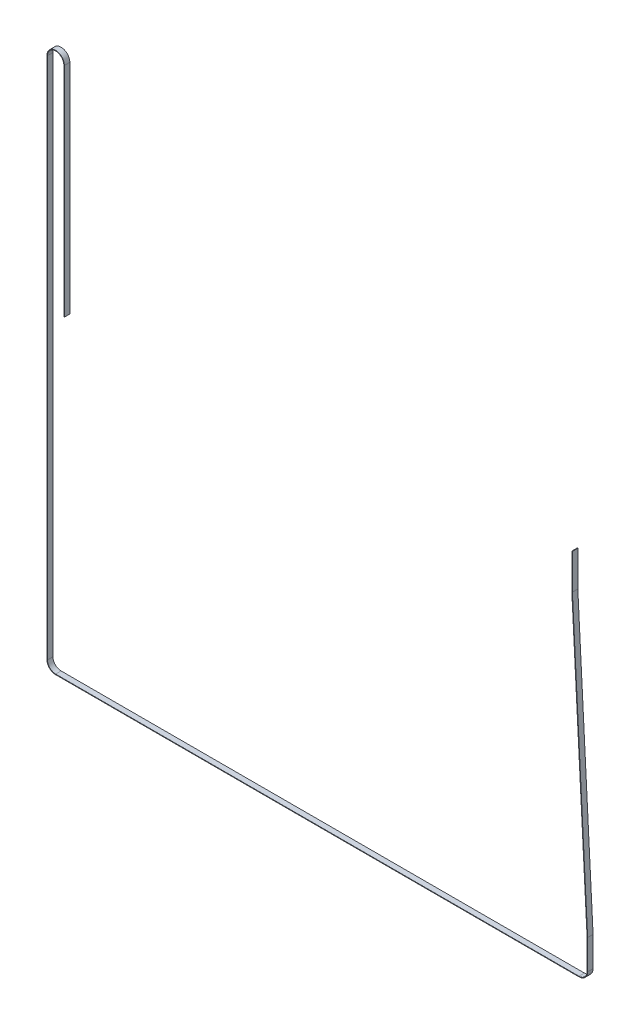
ISO-10303-21;
HEADER;
FILE_DESCRIPTION(('STEP AP214'),'2;1');
FILE_NAME('part.step','',(''),(''),'','','');
FILE_SCHEMA(('AUTOMOTIVE_DESIGN { 1 0 10303 214 1 1 1 1 }'));
ENDSEC;
DATA;
#1=APPLICATION_CONTEXT('core data for automotive mechanical design processes');
#2=APPLICATION_PROTOCOL_DEFINITION('international standard','automotive_design',2000,#1);
#3=PRODUCT_CONTEXT('',#1,'mechanical');
#4=PRODUCT('Part','Part','',(#3));
#5=PRODUCT_RELATED_PRODUCT_CATEGORY('part','',(#4));
#6=PRODUCT_DEFINITION_FORMATION('','',#4);
#7=PRODUCT_DEFINITION_CONTEXT('part definition',#1,'design');
#8=PRODUCT_DEFINITION('design','',#6,#7);
#9=PRODUCT_DEFINITION_SHAPE('','',#8);
#10=(LENGTH_UNIT() NAMED_UNIT(*) SI_UNIT(.MILLI.,.METRE.));
#11=(NAMED_UNIT(*) PLANE_ANGLE_UNIT() SI_UNIT($,.RADIAN.));
#12=(NAMED_UNIT(*) SI_UNIT($,.STERADIAN.) SOLID_ANGLE_UNIT());
#13=UNCERTAINTY_MEASURE_WITH_UNIT(LENGTH_MEASURE(1.E-05),#10,'distance_accuracy_value','');
#14=(GEOMETRIC_REPRESENTATION_CONTEXT(3) GLOBAL_UNCERTAINTY_ASSIGNED_CONTEXT((#13)) GLOBAL_UNIT_ASSIGNED_CONTEXT((#10,
#11,#12)) REPRESENTATION_CONTEXT('',''));
#15=CARTESIAN_POINT('',(0.,0.,0.));
#16=DIRECTION('',(0.,0.,1.));
#17=DIRECTION('',(1.,0.,0.));
#18=AXIS2_PLACEMENT_3D('',#15,#16,#17);
#19=CARTESIAN_POINT('',(-232.5,480.,2.5));
#20=DIRECTION('',(1.,0.,0.));
#21=DIRECTION('',(0.,1.,0.));
#22=AXIS2_PLACEMENT_3D('',#19,#20,#21);
#23=PLANE('',#22);
#24=DIRECTION('',(0.,-1.,0.));
#25=VECTOR('',#24,1.);
#26=CARTESIAN_POINT('',(-232.5,480.,-2.5));
#27=LINE('',#26,#25);
#28=CARTESIAN_POINT('',(-232.5,480.,-2.5));
#29=VERTEX_POINT('',#28);
#30=CARTESIAN_POINT('',(-232.5,280.,-2.5));
#31=VERTEX_POINT('',#30);
#32=EDGE_CURVE('E200',#29,#31,#27,.T.);
#33=ORIENTED_EDGE('',*,*,#32,.T.);
#34=DIRECTION('',(0.,0.,-1.));
#35=VECTOR('',#34,1.);
#36=CARTESIAN_POINT('',(-232.5,280.,2.5));
#37=LINE('',#36,#35);
#38=CARTESIAN_POINT('',(-232.5,280.,2.5));
#39=VERTEX_POINT('',#38);
#40=EDGE_CURVE('E11',#39,#31,#37,.T.);
#41=ORIENTED_EDGE('',*,*,#40,.F.);
#42=DIRECTION('',(0.,-1.,0.));
#43=VECTOR('',#42,1.);
#44=CARTESIAN_POINT('',(-232.5,480.,2.5));
#45=LINE('',#44,#43);
#46=CARTESIAN_POINT('',(-232.5,480.,2.5));
#47=VERTEX_POINT('',#46);
#48=EDGE_CURVE('E125',#47,#39,#45,.T.);
#49=ORIENTED_EDGE('',*,*,#48,.F.);
#50=DIRECTION('',(0.,0.,-1.));
#51=VECTOR('',#50,1.);
#52=CARTESIAN_POINT('',(-232.5,480.,2.5));
#53=LINE('',#52,#51);
#54=EDGE_CURVE('E196',#47,#29,#53,.T.);
#55=ORIENTED_EDGE('',*,*,#54,.T.);
#56=EDGE_LOOP('',(#33,#41,#49,#55));
#57=FACE_BOUND('',#56,.T.);
#58=ADVANCED_FACE('F33',(#57),#23,.F.);
#59=CARTESIAN_POINT('',(-232.,280.,2.5));
#60=DIRECTION('',(0.,-1.,0.));
#61=DIRECTION('',(0.,0.,-1.));
#62=AXIS2_PLACEMENT_3D('',#59,#60,#61);
#63=PLANE('',#62);
#64=DIRECTION('',(-1.,0.,0.));
#65=VECTOR('',#64,1.);
#66=CARTESIAN_POINT('',(-232.,280.,-2.5));
#67=LINE('',#66,#65);
#68=CARTESIAN_POINT('',(-232.,280.,-2.5));
#69=VERTEX_POINT('',#68);
#70=EDGE_CURVE('E203',#69,#31,#67,.T.);
#71=ORIENTED_EDGE('',*,*,#70,.F.);
#72=DIRECTION('',(0.,0.,-1.));
#73=VECTOR('',#72,1.);
#74=CARTESIAN_POINT('',(-232.,280.,2.5));
#75=LINE('',#74,#73);
#76=CARTESIAN_POINT('',(-232.,280.,2.5));
#77=VERTEX_POINT('',#76);
#78=EDGE_CURVE('E41',#77,#69,#75,.T.);
#79=ORIENTED_EDGE('',*,*,#78,.F.);
#80=DIRECTION('',(-1.,0.,0.));
#81=VECTOR('',#80,1.);
#82=CARTESIAN_POINT('',(-232.,280.,2.5));
#83=LINE('',#82,#81);
#84=EDGE_CURVE('E305',#77,#39,#83,.T.);
#85=ORIENTED_EDGE('',*,*,#84,.T.);
#86=ORIENTED_EDGE('',*,*,#40,.T.);
#87=EDGE_LOOP('',(#71,#79,#85,#86));
#88=FACE_BOUND('',#87,.T.);
#89=ADVANCED_FACE('F292',(#88),#63,.T.);
#90=CARTESIAN_POINT('',(-232.,480.,2.5));
#91=DIRECTION('',(1.,0.,0.));
#92=DIRECTION('',(0.,1.,0.));
#93=AXIS2_PLACEMENT_3D('',#90,#91,#92);
#94=PLANE('',#93);
#95=DIRECTION('',(0.,-1.,0.));
#96=VECTOR('',#95,1.);
#97=CARTESIAN_POINT('',(-232.,480.,-2.5));
#98=LINE('',#97,#96);
#99=CARTESIAN_POINT('',(-232.,480.,-2.5));
#100=VERTEX_POINT('',#99);
#101=EDGE_CURVE('E206',#100,#69,#98,.T.);
#102=ORIENTED_EDGE('',*,*,#101,.F.);
#103=DIRECTION('',(0.,0.,-1.));
#104=VECTOR('',#103,1.);
#105=CARTESIAN_POINT('',(-232.,480.,2.5));
#106=LINE('',#105,#104);
#107=CARTESIAN_POINT('',(-232.,480.,2.5));
#108=VERTEX_POINT('',#107);
#109=EDGE_CURVE('E282',#108,#100,#106,.T.);
#110=ORIENTED_EDGE('',*,*,#109,.F.);
#111=DIRECTION('',(0.,-1.,0.));
#112=VECTOR('',#111,1.);
#113=CARTESIAN_POINT('',(-232.,480.,2.5));
#114=LINE('',#113,#112);
#115=EDGE_CURVE('E289',#108,#77,#114,.T.);
#116=ORIENTED_EDGE('',*,*,#115,.T.);
#117=ORIENTED_EDGE('',*,*,#78,.T.);
#118=EDGE_LOOP('',(#102,#110,#116,#117));
#119=FACE_BOUND('',#118,.T.);
#120=ADVANCED_FACE('F287',(#119),#94,.T.);
#121=CARTESIAN_POINT('',(-240.,480.,2.5));
#122=DIRECTION('',(0.,0.,-1.));
#123=DIRECTION('',(-1.,0.,0.));
#124=AXIS2_PLACEMENT_3D('',#121,#122,#123);
#125=CYLINDRICAL_SURFACE('',#124,8.00000000000001);
#126=CARTESIAN_POINT('',(-240.,480.,-2.5));
#127=DIRECTION('',(0.,0.,1.));
#128=DIRECTION('',(1.,0.,0.));
#129=AXIS2_PLACEMENT_3D('',#126,#127,#128);
#130=CIRCLE('',#129,8.00000000000001);
#131=CARTESIAN_POINT('',(-248.,480.,-2.5));
#132=VERTEX_POINT('',#131);
#133=EDGE_CURVE('E209',#132,#100,#130,.F.);
#134=ORIENTED_EDGE('',*,*,#133,.F.);
#135=DIRECTION('',(0.,0.,-1.));
#136=VECTOR('',#135,1.);
#137=CARTESIAN_POINT('',(-248.,480.,2.5));
#138=LINE('',#137,#136);
#139=CARTESIAN_POINT('',(-248.,480.,2.5));
#140=VERTEX_POINT('',#139);
#141=EDGE_CURVE('E280',#140,#132,#138,.T.);
#142=ORIENTED_EDGE('',*,*,#141,.F.);
#143=CARTESIAN_POINT('',(-240.,480.,2.5));
#144=DIRECTION('',(0.,0.,1.));
#145=DIRECTION('',(1.,0.,0.));
#146=AXIS2_PLACEMENT_3D('',#143,#144,#145);
#147=CIRCLE('',#146,8.00000000000001);
#148=EDGE_CURVE('E302',#140,#108,#147,.F.);
#149=ORIENTED_EDGE('',*,*,#148,.T.);
#150=ORIENTED_EDGE('',*,*,#109,.T.);
#151=EDGE_LOOP('',(#134,#142,#149,#150));
#152=FACE_BOUND('',#151,.T.);
#153=ADVANCED_FACE('F299',(#152),#125,.T.);
#154=CARTESIAN_POINT('',(-248.,0.,2.5));
#155=DIRECTION('',(-1.,0.,0.));
#156=DIRECTION('',(0.,0.,1.));
#157=AXIS2_PLACEMENT_3D('',#154,#155,#156);
#158=PLANE('',#157);
#159=DIRECTION('',(0.,1.,0.));
#160=VECTOR('',#159,1.);
#161=CARTESIAN_POINT('',(-248.,0.,-2.5));
#162=LINE('',#161,#160);
#163=CARTESIAN_POINT('',(-248.,0.,-2.5));
#164=VERTEX_POINT('',#163);
#165=EDGE_CURVE('E212',#164,#132,#162,.T.);
#166=ORIENTED_EDGE('',*,*,#165,.F.);
#167=DIRECTION('',(0.,0.,-1.));
#168=VECTOR('',#167,1.);
#169=CARTESIAN_POINT('',(-248.,0.,2.5));
#170=LINE('',#169,#168);
#171=CARTESIAN_POINT('',(-248.,0.,2.5));
#172=VERTEX_POINT('',#171);
#173=EDGE_CURVE('E278',#172,#164,#170,.T.);
#174=ORIENTED_EDGE('',*,*,#173,.F.);
#175=DIRECTION('',(0.,1.,0.));
#176=VECTOR('',#175,1.);
#177=CARTESIAN_POINT('',(-248.,0.,2.5));
#178=LINE('',#177,#176);
#179=EDGE_CURVE('E307',#172,#140,#178,.T.);
#180=ORIENTED_EDGE('',*,*,#179,.T.);
#181=ORIENTED_EDGE('',*,*,#141,.T.);
#182=EDGE_LOOP('',(#166,#174,#180,#181));
#183=FACE_BOUND('',#182,.T.);
#184=ADVANCED_FACE('F373',(#183),#158,.T.);
#185=CARTESIAN_POINT('',(-240.,0.,2.5));
#186=DIRECTION('',(0.,0.,-1.));
#187=DIRECTION('',(-1.,0.,0.));
#188=AXIS2_PLACEMENT_3D('',#185,#186,#187);
#189=CYLINDRICAL_SURFACE('',#188,8.);
#190=CARTESIAN_POINT('',(-240.,0.,-2.5));
#191=DIRECTION('',(0.,0.,1.));
#192=DIRECTION('',(1.,0.,0.));
#193=AXIS2_PLACEMENT_3D('',#190,#191,#192);
#194=CIRCLE('',#193,8.);
#195=CARTESIAN_POINT('',(-240.,-8.00000000000002,-2.5));
#196=VERTEX_POINT('',#195);
#197=EDGE_CURVE('E215',#196,#164,#194,.F.);
#198=ORIENTED_EDGE('',*,*,#197,.F.);
#199=DIRECTION('',(0.,0.,-1.));
#200=VECTOR('',#199,1.);
#201=CARTESIAN_POINT('',(-240.,-8.00000000000002,2.5));
#202=LINE('',#201,#200);
#203=CARTESIAN_POINT('',(-240.,-8.00000000000002,2.5));
#204=VERTEX_POINT('',#203);
#205=EDGE_CURVE('E276',#204,#196,#202,.T.);
#206=ORIENTED_EDGE('',*,*,#205,.F.);
#207=CARTESIAN_POINT('',(-240.,0.,2.5));
#208=DIRECTION('',(0.,0.,1.));
#209=DIRECTION('',(1.,0.,0.));
#210=AXIS2_PLACEMENT_3D('',#207,#208,#209);
#211=CIRCLE('',#210,8.);
#212=EDGE_CURVE('E313',#204,#172,#211,.F.);
#213=ORIENTED_EDGE('',*,*,#212,.T.);
#214=ORIENTED_EDGE('',*,*,#173,.T.);
#215=EDGE_LOOP('',(#198,#206,#213,#214));
#216=FACE_BOUND('',#215,.T.);
#217=ADVANCED_FACE('F376',(#216),#189,.T.);
#218=CARTESIAN_POINT('',(240.,-8.00000000000001,2.5));
#219=DIRECTION('',(0.,-1.,0.));
#220=DIRECTION('',(0.,0.,-1.));
#221=AXIS2_PLACEMENT_3D('',#218,#219,#220);
#222=PLANE('',#221);
#223=DIRECTION('',(1.,0.,0.));
#224=VECTOR('',#223,1.);
#225=CARTESIAN_POINT('',(240.,-8.00000000000001,-2.5));
#226=LINE('',#225,#224);
#227=CARTESIAN_POINT('',(240.,-8.00000000000001,-2.5));
#228=VERTEX_POINT('',#227);
#229=EDGE_CURVE('E218',#228,#196,#226,.F.);
#230=ORIENTED_EDGE('',*,*,#229,.F.);
#231=DIRECTION('',(0.,0.,-1.));
#232=VECTOR('',#231,1.);
#233=CARTESIAN_POINT('',(240.,-8.00000000000001,2.5));
#234=LINE('',#233,#232);
#235=CARTESIAN_POINT('',(240.,-8.00000000000001,2.5));
#236=VERTEX_POINT('',#235);
#237=EDGE_CURVE('E274',#236,#228,#234,.T.);
#238=ORIENTED_EDGE('',*,*,#237,.F.);
#239=DIRECTION('',(1.,0.,0.));
#240=VECTOR('',#239,1.);
#241=CARTESIAN_POINT('',(240.,-8.00000000000001,2.5));
#242=LINE('',#241,#240);
#243=EDGE_CURVE('E316',#236,#204,#242,.F.);
#244=ORIENTED_EDGE('',*,*,#243,.T.);
#245=ORIENTED_EDGE('',*,*,#205,.T.);
#246=EDGE_LOOP('',(#230,#238,#244,#245));
#247=FACE_BOUND('',#246,.T.);
#248=ADVANCED_FACE('F380',(#247),#222,.T.);
#249=CARTESIAN_POINT('',(240.,0.,2.5));
#250=DIRECTION('',(0.,0.,-1.));
#251=DIRECTION('',(-1.,0.,0.));
#252=AXIS2_PLACEMENT_3D('',#249,#250,#251);
#253=CYLINDRICAL_SURFACE('',#252,8.00000000000004);
#254=CARTESIAN_POINT('',(240.,0.,-2.5));
#255=DIRECTION('',(0.,0.,1.));
#256=DIRECTION('',(1.,0.,0.));
#257=AXIS2_PLACEMENT_3D('',#254,#255,#256);
#258=CIRCLE('',#257,8.00000000000004);
#259=CARTESIAN_POINT('',(248.,0.,-2.5));
#260=VERTEX_POINT('',#259);
#261=EDGE_CURVE('E221',#260,#228,#258,.F.);
#262=ORIENTED_EDGE('',*,*,#261,.F.);
#263=DIRECTION('',(0.,0.,-1.));
#264=VECTOR('',#263,1.);
#265=CARTESIAN_POINT('',(248.,0.,2.5));
#266=LINE('',#265,#264);
#267=CARTESIAN_POINT('',(248.,0.,2.5));
#268=VERTEX_POINT('',#267);
#269=EDGE_CURVE('E272',#268,#260,#266,.T.);
#270=ORIENTED_EDGE('',*,*,#269,.F.);
#271=CARTESIAN_POINT('',(240.,0.,2.5));
#272=DIRECTION('',(0.,0.,1.));
#273=DIRECTION('',(1.,0.,0.));
#274=AXIS2_PLACEMENT_3D('',#271,#272,#273);
#275=CIRCLE('',#274,8.00000000000004);
#276=EDGE_CURVE('E319',#268,#236,#275,.F.);
#277=ORIENTED_EDGE('',*,*,#276,.T.);
#278=ORIENTED_EDGE('',*,*,#237,.T.);
#279=EDGE_LOOP('',(#262,#270,#277,#278));
#280=FACE_BOUND('',#279,.T.);
#281=ADVANCED_FACE('F384',(#280),#253,.T.);
#282=CARTESIAN_POINT('',(248.,0.,2.5));
#283=DIRECTION('',(1.,0.,0.));
#284=DIRECTION('',(0.,0.,-1.));
#285=AXIS2_PLACEMENT_3D('',#282,#283,#284);
#286=PLANE('',#285);
#287=DIRECTION('',(0.,1.,0.));
#288=VECTOR('',#287,1.);
#289=CARTESIAN_POINT('',(248.,0.,-2.5));
#290=LINE('',#289,#288);
#291=CARTESIAN_POINT('',(248.,27.2000923644169,-2.5));
#292=VERTEX_POINT('',#291);
#293=EDGE_CURVE('E224',#292,#260,#290,.F.);
#294=ORIENTED_EDGE('',*,*,#293,.F.);
#295=DIRECTION('',(0.,0.,-1.));
#296=VECTOR('',#295,1.);
#297=CARTESIAN_POINT('',(248.,27.2000923644169,2.5));
#298=LINE('',#297,#296);
#299=CARTESIAN_POINT('',(248.,27.2000923644169,2.5));
#300=VERTEX_POINT('',#299);
#301=EDGE_CURVE('E270',#300,#292,#298,.T.);
#302=ORIENTED_EDGE('',*,*,#301,.F.);
#303=DIRECTION('',(0.,1.,0.));
#304=VECTOR('',#303,1.);
#305=CARTESIAN_POINT('',(248.,0.,2.5));
#306=LINE('',#305,#304);
#307=EDGE_CURVE('E322',#300,#268,#306,.F.);
#308=ORIENTED_EDGE('',*,*,#307,.T.);
#309=ORIENTED_EDGE('',*,*,#269,.T.);
#310=EDGE_LOOP('',(#294,#302,#308,#309));
#311=FACE_BOUND('',#310,.T.);
#312=ADVANCED_FACE('F388',(#311),#286,.T.);
#313=CARTESIAN_POINT('',(247.999316066725,27.2131550048534,2.5));
#314=DIRECTION('',(0.998632133450605,0.0522863465915646,0.));
#315=DIRECTION('',(-0.0522863465915646,0.998632133450605,0.));
#316=AXIS2_PLACEMENT_3D('',#313,#314,#315);
#317=PLANE('',#316);
#318=DIRECTION('',(0.0522863465915646,-0.998632133450605,0.));
#319=VECTOR('',#318,1.);
#320=CARTESIAN_POINT('',(247.999316066725,27.2131550048534,-2.5));
#321=LINE('',#320,#319);
#322=CARTESIAN_POINT('',(234.,294.590162233327,-2.5));
#323=VERTEX_POINT('',#322);
#324=EDGE_CURVE('E227',#323,#292,#321,.T.);
#325=ORIENTED_EDGE('',*,*,#324,.F.);
#326=DIRECTION('',(0.,0.,-1.));
#327=VECTOR('',#326,1.);
#328=CARTESIAN_POINT('',(234.,294.590162233327,2.5));
#329=LINE('',#328,#327);
#330=CARTESIAN_POINT('',(234.,294.590162233327,2.5));
#331=VERTEX_POINT('',#330);
#332=EDGE_CURVE('E268',#331,#323,#329,.T.);
#333=ORIENTED_EDGE('',*,*,#332,.F.);
#334=DIRECTION('',(0.0522863465915646,-0.998632133450605,0.));
#335=VECTOR('',#334,1.);
#336=CARTESIAN_POINT('',(247.999316066725,27.2131550048534,2.5));
#337=LINE('',#336,#335);
#338=EDGE_CURVE('E325',#331,#300,#337,.T.);
#339=ORIENTED_EDGE('',*,*,#338,.T.);
#340=ORIENTED_EDGE('',*,*,#301,.T.);
#341=EDGE_LOOP('',(#325,#333,#339,#340));
#342=FACE_BOUND('',#341,.T.);
#343=ADVANCED_FACE('F392',(#342),#317,.T.);
#344=CARTESIAN_POINT('',(234.,294.577081700467,2.5));
#345=DIRECTION('',(1.,0.,0.));
#346=DIRECTION('',(0.,0.,-1.));
#347=AXIS2_PLACEMENT_3D('',#344,#345,#346);
#348=PLANE('',#347);
#349=DIRECTION('',(0.,1.,0.));
#350=VECTOR('',#349,1.);
#351=CARTESIAN_POINT('',(234.,294.577081700467,-2.5));
#352=LINE('',#351,#350);
#353=CARTESIAN_POINT('',(234.,326.96142128205,-2.5));
#354=VERTEX_POINT('',#353);
#355=EDGE_CURVE('E230',#354,#323,#352,.F.);
#356=ORIENTED_EDGE('',*,*,#355,.F.);
#357=DIRECTION('',(0.,0.,-1.));
#358=VECTOR('',#357,1.);
#359=CARTESIAN_POINT('',(234.,326.96142128205,2.5));
#360=LINE('',#359,#358);
#361=CARTESIAN_POINT('',(234.,326.96142128205,2.5));
#362=VERTEX_POINT('',#361);
#363=EDGE_CURVE('E266',#362,#354,#360,.T.);
#364=ORIENTED_EDGE('',*,*,#363,.F.);
#365=DIRECTION('',(0.,1.,0.));
#366=VECTOR('',#365,1.);
#367=CARTESIAN_POINT('',(234.,294.577081700467,2.5));
#368=LINE('',#367,#366);
#369=EDGE_CURVE('E328',#362,#331,#368,.F.);
#370=ORIENTED_EDGE('',*,*,#369,.T.);
#371=ORIENTED_EDGE('',*,*,#332,.T.);
#372=EDGE_LOOP('',(#356,#364,#370,#371));
#373=FACE_BOUND('',#372,.T.);
#374=ADVANCED_FACE('F396',(#373),#348,.T.);
#375=CARTESIAN_POINT('',(233.5,326.96142128205,2.5));
#376=DIRECTION('',(0.,1.,0.));
#377=DIRECTION('',(0.,0.,1.));
#378=AXIS2_PLACEMENT_3D('',#375,#376,#377);
#379=PLANE('',#378);
#380=DIRECTION('',(1.,0.,0.));
#381=VECTOR('',#380,1.);
#382=CARTESIAN_POINT('',(233.5,326.96142128205,-2.5));
#383=LINE('',#382,#381);
#384=CARTESIAN_POINT('',(233.5,326.96142128205,-2.5));
#385=VERTEX_POINT('',#384);
#386=EDGE_CURVE('E233',#385,#354,#383,.T.);
#387=ORIENTED_EDGE('',*,*,#386,.F.);
#388=DIRECTION('',(0.,0.,-1.));
#389=VECTOR('',#388,1.);
#390=CARTESIAN_POINT('',(233.5,326.96142128205,2.5));
#391=LINE('',#390,#389);
#392=CARTESIAN_POINT('',(233.5,326.96142128205,2.5));
#393=VERTEX_POINT('',#392);
#394=EDGE_CURVE('E264',#393,#385,#391,.T.);
#395=ORIENTED_EDGE('',*,*,#394,.F.);
#396=DIRECTION('',(1.,0.,0.));
#397=VECTOR('',#396,1.);
#398=CARTESIAN_POINT('',(233.5,326.96142128205,2.5));
#399=LINE('',#398,#397);
#400=EDGE_CURVE('E331',#393,#362,#399,.T.);
#401=ORIENTED_EDGE('',*,*,#400,.T.);
#402=ORIENTED_EDGE('',*,*,#363,.T.);
#403=EDGE_LOOP('',(#387,#395,#401,#402));
#404=FACE_BOUND('',#403,.T.);
#405=ADVANCED_FACE('F400',(#404),#379,.T.);
#406=CARTESIAN_POINT('',(233.5,294.577081700467,2.5));
#407=DIRECTION('',(1.,0.,0.));
#408=DIRECTION('',(0.,0.,-1.));
#409=AXIS2_PLACEMENT_3D('',#406,#407,#408);
#410=PLANE('',#409);
#411=DIRECTION('',(0.,-1.,0.));
#412=VECTOR('',#411,1.);
#413=CARTESIAN_POINT('',(233.5,294.577081700467,-2.5));
#414=LINE('',#413,#412);
#415=CARTESIAN_POINT('',(233.5,294.577081700467,-2.5));
#416=VERTEX_POINT('',#415);
#417=EDGE_CURVE('E236',#385,#416,#414,.T.);
#418=ORIENTED_EDGE('',*,*,#417,.T.);
#419=DIRECTION('',(0.,0.,-1.));
#420=VECTOR('',#419,1.);
#421=CARTESIAN_POINT('',(233.5,294.577081700467,2.5));
#422=LINE('',#421,#420);
#423=CARTESIAN_POINT('',(233.5,294.577081700467,2.5));
#424=VERTEX_POINT('',#423);
#425=EDGE_CURVE('E261',#424,#416,#422,.T.);
#426=ORIENTED_EDGE('',*,*,#425,.F.);
#427=DIRECTION('',(0.,-1.,0.));
#428=VECTOR('',#427,1.);
#429=CARTESIAN_POINT('',(233.5,294.577081700467,2.5));
#430=LINE('',#429,#428);
#431=EDGE_CURVE('E334',#393,#424,#430,.T.);
#432=ORIENTED_EDGE('',*,*,#431,.F.);
#433=ORIENTED_EDGE('',*,*,#394,.T.);
#434=EDGE_LOOP('',(#418,#426,#432,#433));
#435=FACE_BOUND('',#434,.T.);
#436=ADVANCED_FACE('F404',(#435),#410,.F.);
#437=CARTESIAN_POINT('',(247.5,27.1870118315576,2.5));
#438=DIRECTION('',(0.998632133450605,0.0522863465915646,0.));
#439=DIRECTION('',(-0.0522863465915646,0.998632133450605,0.));
#440=AXIS2_PLACEMENT_3D('',#437,#438,#439);
#441=PLANE('',#440);
#442=DIRECTION('',(0.0522863465915646,-0.998632133450605,0.));
#443=VECTOR('',#442,1.);
#444=CARTESIAN_POINT('',(247.5,27.1870118315576,-2.5));
#445=LINE('',#444,#443);
#446=CARTESIAN_POINT('',(247.5,27.1870118315576,-2.5));
#447=VERTEX_POINT('',#446);
#448=EDGE_CURVE('E238',#416,#447,#445,.T.);
#449=ORIENTED_EDGE('',*,*,#448,.T.);
#450=DIRECTION('',(0.,0.,-1.));
#451=VECTOR('',#450,1.);
#452=CARTESIAN_POINT('',(247.5,27.1870118315576,2.5));
#453=LINE('',#452,#451);
#454=CARTESIAN_POINT('',(247.5,27.1870118315576,2.5));
#455=VERTEX_POINT('',#454);
#456=EDGE_CURVE('E258',#455,#447,#453,.T.);
#457=ORIENTED_EDGE('',*,*,#456,.F.);
#458=DIRECTION('',(0.0522863465915646,-0.998632133450605,0.));
#459=VECTOR('',#458,1.);
#460=CARTESIAN_POINT('',(247.5,27.1870118315576,2.5));
#461=LINE('',#460,#459);
#462=EDGE_CURVE('E336',#424,#455,#461,.T.);
#463=ORIENTED_EDGE('',*,*,#462,.F.);
#464=ORIENTED_EDGE('',*,*,#425,.T.);
#465=EDGE_LOOP('',(#449,#457,#463,#464));
#466=FACE_BOUND('',#465,.T.);
#467=ADVANCED_FACE('F408',(#466),#441,.F.);
#468=CARTESIAN_POINT('',(247.5,0.,2.5));
#469=DIRECTION('',(1.,0.,0.));
#470=DIRECTION('',(0.,0.,-1.));
#471=AXIS2_PLACEMENT_3D('',#468,#469,#470);
#472=PLANE('',#471);
#473=DIRECTION('',(0.,-1.,0.));
#474=VECTOR('',#473,1.);
#475=CARTESIAN_POINT('',(247.5,0.,-2.5));
#476=LINE('',#475,#474);
#477=CARTESIAN_POINT('',(247.5,0.,-2.5));
#478=VERTEX_POINT('',#477);
#479=EDGE_CURVE('E240',#447,#478,#476,.T.);
#480=ORIENTED_EDGE('',*,*,#479,.T.);
#481=DIRECTION('',(0.,0.,-1.));
#482=VECTOR('',#481,1.);
#483=CARTESIAN_POINT('',(247.5,0.,2.5));
#484=LINE('',#483,#482);
#485=CARTESIAN_POINT('',(247.5,0.,2.5));
#486=VERTEX_POINT('',#485);
#487=EDGE_CURVE('E255',#486,#478,#484,.T.);
#488=ORIENTED_EDGE('',*,*,#487,.F.);
#489=DIRECTION('',(0.,-1.,0.));
#490=VECTOR('',#489,1.);
#491=CARTESIAN_POINT('',(247.5,0.,2.5));
#492=LINE('',#491,#490);
#493=EDGE_CURVE('E338',#455,#486,#492,.T.);
#494=ORIENTED_EDGE('',*,*,#493,.F.);
#495=ORIENTED_EDGE('',*,*,#456,.T.);
#496=EDGE_LOOP('',(#480,#488,#494,#495));
#497=FACE_BOUND('',#496,.T.);
#498=ADVANCED_FACE('F412',(#497),#472,.F.);
#499=CARTESIAN_POINT('',(240.,0.,2.5));
#500=DIRECTION('',(0.,0.,-1.));
#501=DIRECTION('',(-1.,0.,0.));
#502=AXIS2_PLACEMENT_3D('',#499,#500,#501);
#503=CYLINDRICAL_SURFACE('',#502,7.50000000000004);
#504=CARTESIAN_POINT('',(240.,0.,-2.5));
#505=DIRECTION('',(0.,0.,-1.));
#506=DIRECTION('',(-1.,0.,0.));
#507=AXIS2_PLACEMENT_3D('',#504,#505,#506);
#508=CIRCLE('',#507,7.50000000000004);
#509=CARTESIAN_POINT('',(240.,-7.50000000000001,-2.5));
#510=VERTEX_POINT('',#509);
#511=EDGE_CURVE('E242',#478,#510,#508,.T.);
#512=ORIENTED_EDGE('',*,*,#511,.T.);
#513=DIRECTION('',(0.,0.,-1.));
#514=VECTOR('',#513,1.);
#515=CARTESIAN_POINT('',(240.,-7.50000000000001,2.5));
#516=LINE('',#515,#514);
#517=CARTESIAN_POINT('',(240.,-7.50000000000001,2.5));
#518=VERTEX_POINT('',#517);
#519=EDGE_CURVE('E252',#518,#510,#516,.T.);
#520=ORIENTED_EDGE('',*,*,#519,.F.);
#521=CARTESIAN_POINT('',(240.,0.,2.5));
#522=DIRECTION('',(0.,0.,-1.));
#523=DIRECTION('',(-1.,0.,0.));
#524=AXIS2_PLACEMENT_3D('',#521,#522,#523);
#525=CIRCLE('',#524,7.50000000000004);
#526=EDGE_CURVE('E340',#486,#518,#525,.T.);
#527=ORIENTED_EDGE('',*,*,#526,.F.);
#528=ORIENTED_EDGE('',*,*,#487,.T.);
#529=EDGE_LOOP('',(#512,#520,#527,#528));
#530=FACE_BOUND('',#529,.T.);
#531=ADVANCED_FACE('F346',(#530),#503,.F.);
#532=CARTESIAN_POINT('',(240.,-7.50000000000001,2.5));
#533=DIRECTION('',(0.,-1.,0.));
#534=DIRECTION('',(0.,0.,-1.));
#535=AXIS2_PLACEMENT_3D('',#532,#533,#534);
#536=PLANE('',#535);
#537=DIRECTION('',(-1.,0.,0.));
#538=VECTOR('',#537,1.);
#539=CARTESIAN_POINT('',(240.,-7.50000000000001,-2.5));
#540=LINE('',#539,#538);
#541=CARTESIAN_POINT('',(-240.,-7.50000000000002,-2.5));
#542=VERTEX_POINT('',#541);
#543=EDGE_CURVE('E244',#510,#542,#540,.T.);
#544=ORIENTED_EDGE('',*,*,#543,.T.);
#545=DIRECTION('',(0.,0.,-1.));
#546=VECTOR('',#545,1.);
#547=CARTESIAN_POINT('',(-240.,-7.50000000000002,2.5));
#548=LINE('',#547,#546);
#549=CARTESIAN_POINT('',(-240.,-7.50000000000002,2.5));
#550=VERTEX_POINT('',#549);
#551=EDGE_CURVE('E191',#550,#542,#548,.T.);
#552=ORIENTED_EDGE('',*,*,#551,.F.);
#553=DIRECTION('',(-1.,0.,0.));
#554=VECTOR('',#553,1.);
#555=CARTESIAN_POINT('',(240.,-7.50000000000001,2.5));
#556=LINE('',#555,#554);
#557=EDGE_CURVE('E182',#518,#550,#556,.T.);
#558=ORIENTED_EDGE('',*,*,#557,.F.);
#559=ORIENTED_EDGE('',*,*,#519,.T.);
#560=EDGE_LOOP('',(#544,#552,#558,#559));
#561=FACE_BOUND('',#560,.T.);
#562=ADVANCED_FACE('F350',(#561),#536,.F.);
#563=CARTESIAN_POINT('',(-240.,0.,2.5));
#564=DIRECTION('',(0.,0.,-1.));
#565=DIRECTION('',(-1.,0.,0.));
#566=AXIS2_PLACEMENT_3D('',#563,#564,#565);
#567=CYLINDRICAL_SURFACE('',#566,7.5);
#568=CARTESIAN_POINT('',(-240.,0.,-2.5));
#569=DIRECTION('',(0.,0.,-1.));
#570=DIRECTION('',(1.,0.,0.));
#571=AXIS2_PLACEMENT_3D('',#568,#569,#570);
#572=CIRCLE('',#571,7.5);
#573=CARTESIAN_POINT('',(-247.5,0.,-2.5));
#574=VERTEX_POINT('',#573);
#575=EDGE_CURVE('E190',#542,#574,#572,.T.);
#576=ORIENTED_EDGE('',*,*,#575,.T.);
#577=DIRECTION('',(0.,0.,-1.));
#578=VECTOR('',#577,1.);
#579=CARTESIAN_POINT('',(-247.5,0.,2.5));
#580=LINE('',#579,#578);
#581=CARTESIAN_POINT('',(-247.5,0.,2.5));
#582=VERTEX_POINT('',#581);
#583=EDGE_CURVE('E187',#582,#574,#580,.T.);
#584=ORIENTED_EDGE('',*,*,#583,.F.);
#585=CARTESIAN_POINT('',(-240.,0.,2.5));
#586=DIRECTION('',(0.,0.,-1.));
#587=DIRECTION('',(1.,0.,0.));
#588=AXIS2_PLACEMENT_3D('',#585,#586,#587);
#589=CIRCLE('',#588,7.5);
#590=EDGE_CURVE('E176',#550,#582,#589,.T.);
#591=ORIENTED_EDGE('',*,*,#590,.F.);
#592=ORIENTED_EDGE('',*,*,#551,.T.);
#593=EDGE_LOOP('',(#576,#584,#591,#592));
#594=FACE_BOUND('',#593,.T.);
#595=ADVANCED_FACE('F188',(#594),#567,.F.);
#596=CARTESIAN_POINT('',(-247.5,0.,2.5));
#597=DIRECTION('',(-1.,0.,0.));
#598=DIRECTION('',(0.,0.,1.));
#599=AXIS2_PLACEMENT_3D('',#596,#597,#598);
#600=PLANE('',#599);
#601=DIRECTION('',(0.,1.,0.));
#602=VECTOR('',#601,1.);
#603=CARTESIAN_POINT('',(-247.5,0.,-2.5));
#604=LINE('',#603,#602);
#605=CARTESIAN_POINT('',(-247.5,480.,-2.5));
#606=VERTEX_POINT('',#605);
#607=EDGE_CURVE('E113',#574,#606,#604,.T.);
#608=ORIENTED_EDGE('',*,*,#607,.T.);
#609=DIRECTION('',(0.,0.,-1.));
#610=VECTOR('',#609,1.);
#611=CARTESIAN_POINT('',(-247.5,480.,2.5));
#612=LINE('',#611,#610);
#613=CARTESIAN_POINT('',(-247.5,480.,2.5));
#614=VERTEX_POINT('',#613);
#615=EDGE_CURVE('E192',#614,#606,#612,.T.);
#616=ORIENTED_EDGE('',*,*,#615,.F.);
#617=DIRECTION('',(0.,1.,0.));
#618=VECTOR('',#617,1.);
#619=CARTESIAN_POINT('',(-247.5,0.,2.5));
#620=LINE('',#619,#618);
#621=EDGE_CURVE('E180',#582,#614,#620,.T.);
#622=ORIENTED_EDGE('',*,*,#621,.F.);
#623=ORIENTED_EDGE('',*,*,#583,.T.);
#624=EDGE_LOOP('',(#608,#616,#622,#623));
#625=FACE_BOUND('',#624,.T.);
#626=ADVANCED_FACE('F194',(#625),#600,.F.);
#627=CARTESIAN_POINT('',(-240.,480.,2.5));
#628=DIRECTION('',(0.,0.,-1.));
#629=DIRECTION('',(-1.,0.,0.));
#630=AXIS2_PLACEMENT_3D('',#627,#628,#629);
#631=CYLINDRICAL_SURFACE('',#630,7.50000000000001);
#632=CARTESIAN_POINT('',(-240.,480.,-2.5));
#633=DIRECTION('',(0.,0.,-1.));
#634=DIRECTION('',(1.,0.,0.));
#635=AXIS2_PLACEMENT_3D('',#632,#633,#634);
#636=CIRCLE('',#635,7.50000000000001);
#637=EDGE_CURVE('E119',#606,#29,#636,.T.);
#638=ORIENTED_EDGE('',*,*,#637,.T.);
#639=ORIENTED_EDGE('',*,*,#54,.F.);
#640=CARTESIAN_POINT('',(-240.,480.,2.5));
#641=DIRECTION('',(0.,0.,-1.));
#642=DIRECTION('',(1.,0.,0.));
#643=AXIS2_PLACEMENT_3D('',#640,#641,#642);
#644=CIRCLE('',#643,7.50000000000001);
#645=EDGE_CURVE('E49',#614,#47,#644,.T.);
#646=ORIENTED_EDGE('',*,*,#645,.F.);
#647=ORIENTED_EDGE('',*,*,#615,.T.);
#648=EDGE_LOOP('',(#638,#639,#646,#647));
#649=FACE_BOUND('',#648,.T.);
#650=ADVANCED_FACE('F352',(#649),#631,.F.);
#651=CARTESIAN_POINT('',(-240.,480.,2.5));
#652=DIRECTION('',(0.,0.,1.));
#653=DIRECTION('',(1.,0.,0.));
#654=AXIS2_PLACEMENT_3D('',#651,#652,#653);
#655=PLANE('',#654);
#656=ORIENTED_EDGE('',*,*,#48,.T.);
#657=ORIENTED_EDGE('',*,*,#84,.F.);
#658=ORIENTED_EDGE('',*,*,#115,.F.);
#659=ORIENTED_EDGE('',*,*,#148,.F.);
#660=ORIENTED_EDGE('',*,*,#179,.F.);
#661=ORIENTED_EDGE('',*,*,#212,.F.);
#662=ORIENTED_EDGE('',*,*,#243,.F.);
#663=ORIENTED_EDGE('',*,*,#276,.F.);
#664=ORIENTED_EDGE('',*,*,#307,.F.);
#665=ORIENTED_EDGE('',*,*,#338,.F.);
#666=ORIENTED_EDGE('',*,*,#369,.F.);
#667=ORIENTED_EDGE('',*,*,#400,.F.);
#668=ORIENTED_EDGE('',*,*,#431,.T.);
#669=ORIENTED_EDGE('',*,*,#462,.T.);
#670=ORIENTED_EDGE('',*,*,#493,.T.);
#671=ORIENTED_EDGE('',*,*,#526,.T.);
#672=ORIENTED_EDGE('',*,*,#557,.T.);
#673=ORIENTED_EDGE('',*,*,#590,.T.);
#674=ORIENTED_EDGE('',*,*,#621,.T.);
#675=ORIENTED_EDGE('',*,*,#645,.T.);
#676=EDGE_LOOP('',(#656,#657,#658,#659,#660,#661,#662,#663,#664,#665,#666,#667,#668,#669,#670,
#671,#672,#673,#674,#675));
#677=FACE_BOUND('',#676,.T.);
#678=ADVANCED_FACE('F178',(#677),#655,.T.);
#679=CARTESIAN_POINT('',(-240.,480.,-2.5));
#680=DIRECTION('',(0.,0.,1.));
#681=DIRECTION('',(1.,0.,0.));
#682=AXIS2_PLACEMENT_3D('',#679,#680,#681);
#683=PLANE('',#682);
#684=ORIENTED_EDGE('',*,*,#32,.F.);
#685=ORIENTED_EDGE('',*,*,#637,.F.);
#686=ORIENTED_EDGE('',*,*,#607,.F.);
#687=ORIENTED_EDGE('',*,*,#575,.F.);
#688=ORIENTED_EDGE('',*,*,#543,.F.);
#689=ORIENTED_EDGE('',*,*,#511,.F.);
#690=ORIENTED_EDGE('',*,*,#479,.F.);
#691=ORIENTED_EDGE('',*,*,#448,.F.);
#692=ORIENTED_EDGE('',*,*,#417,.F.);
#693=ORIENTED_EDGE('',*,*,#386,.T.);
#694=ORIENTED_EDGE('',*,*,#355,.T.);
#695=ORIENTED_EDGE('',*,*,#324,.T.);
#696=ORIENTED_EDGE('',*,*,#293,.T.);
#697=ORIENTED_EDGE('',*,*,#261,.T.);
#698=ORIENTED_EDGE('',*,*,#229,.T.);
#699=ORIENTED_EDGE('',*,*,#197,.T.);
#700=ORIENTED_EDGE('',*,*,#165,.T.);
#701=ORIENTED_EDGE('',*,*,#133,.T.);
#702=ORIENTED_EDGE('',*,*,#101,.T.);
#703=ORIENTED_EDGE('',*,*,#70,.T.);
#704=EDGE_LOOP('',(#684,#685,#686,#687,#688,#689,#690,#691,#692,#693,#694,#695,#696,#697,#698,
#699,#700,#701,#702,#703));
#705=FACE_BOUND('',#704,.T.);
#706=ADVANCED_FACE('F295',(#705),#683,.F.);
#707=CLOSED_SHELL('',(#58,#89,#120,#153,#184,#217,#248,#281,#312,#343,#374,#405,#436,#467,#498,
#531,#562,#595,#626,#650,#678,#706));
#708=MANIFOLD_SOLID_BREP('B2',#707);
#709=ADVANCED_BREP_SHAPE_REPRESENTATION('',(#18,#708),#14);
#710=SHAPE_DEFINITION_REPRESENTATION(#9,#709);
ENDSEC;
END-ISO-10303-21;
